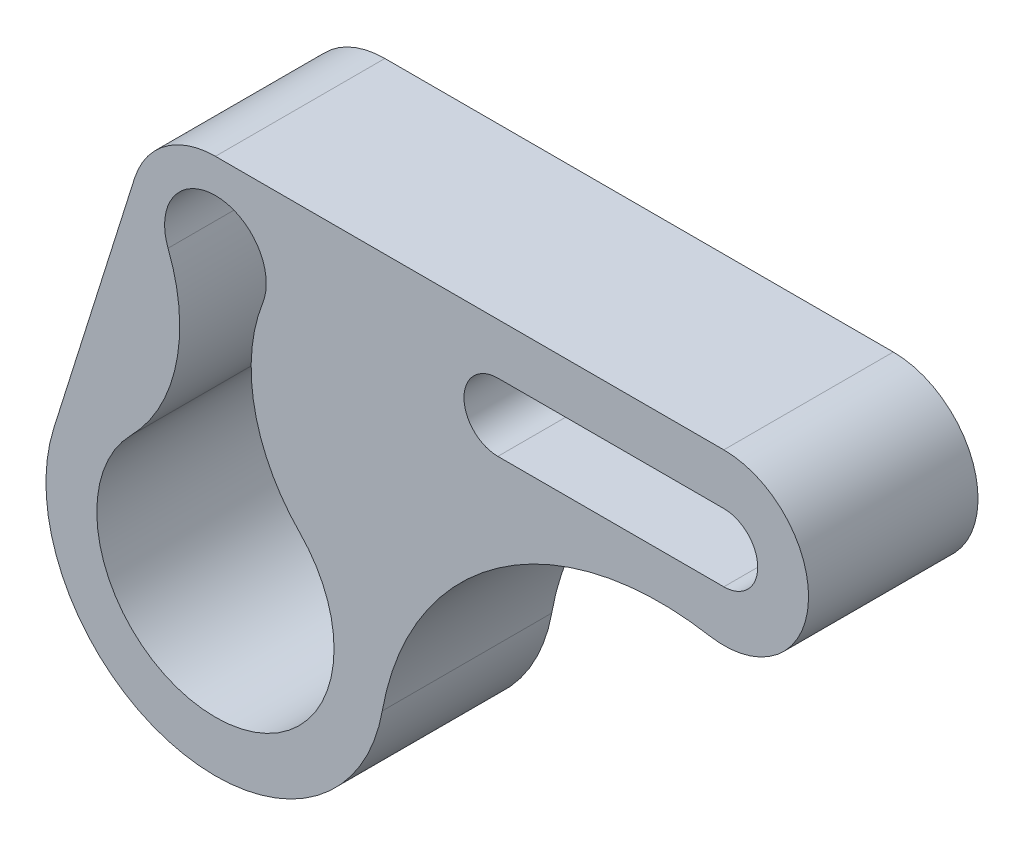
ISO-10303-21;
HEADER;
FILE_DESCRIPTION(('STEP AP214'),'2;1');
FILE_NAME('part.step','',(''),(''),'','','');
FILE_SCHEMA(('AUTOMOTIVE_DESIGN { 1 0 10303 214 1 1 1 1 }'));
ENDSEC;
DATA;
#1=APPLICATION_CONTEXT('core data for automotive mechanical design processes');
#2=APPLICATION_PROTOCOL_DEFINITION('international standard','automotive_design',2000,#1);
#3=PRODUCT_CONTEXT('',#1,'mechanical');
#4=PRODUCT('Part','Part','',(#3));
#5=PRODUCT_RELATED_PRODUCT_CATEGORY('part','',(#4));
#6=PRODUCT_DEFINITION_FORMATION('','',#4);
#7=PRODUCT_DEFINITION_CONTEXT('part definition',#1,'design');
#8=PRODUCT_DEFINITION('design','',#6,#7);
#9=PRODUCT_DEFINITION_SHAPE('','',#8);
#10=(LENGTH_UNIT() NAMED_UNIT(*) SI_UNIT(.MILLI.,.METRE.));
#11=(NAMED_UNIT(*) PLANE_ANGLE_UNIT() SI_UNIT($,.RADIAN.));
#12=(NAMED_UNIT(*) SI_UNIT($,.STERADIAN.) SOLID_ANGLE_UNIT());
#13=UNCERTAINTY_MEASURE_WITH_UNIT(LENGTH_MEASURE(1.E-05),#10,'distance_accuracy_value','');
#14=(GEOMETRIC_REPRESENTATION_CONTEXT(3) GLOBAL_UNCERTAINTY_ASSIGNED_CONTEXT((#13)) GLOBAL_UNIT_ASSIGNED_CONTEXT((#10,
#11,#12)) REPRESENTATION_CONTEXT('',''));
#15=CARTESIAN_POINT('',(0.,0.,0.));
#16=DIRECTION('',(0.,0.,1.));
#17=DIRECTION('',(1.,0.,0.));
#18=AXIS2_PLACEMENT_3D('',#15,#16,#17);
#19=CARTESIAN_POINT('',(0.,50.,15.));
#20=DIRECTION('',(0.,0.,1.));
#21=DIRECTION('',(1.,0.,0.));
#22=AXIS2_PLACEMENT_3D('',#19,#20,#21);
#23=PLANE('',#22);
#24=CARTESIAN_POINT('',(0.,50.,15.));
#25=DIRECTION('',(0.,0.,1.));
#26=DIRECTION('',(1.,0.,0.));
#27=AXIS2_PLACEMENT_3D('',#24,#25,#26);
#28=CIRCLE('',#27,14.9999999999994);
#29=CARTESIAN_POINT('',(0.,64.9999999999989,15.));
#30=VERTEX_POINT('',#29);
#31=CARTESIAN_POINT('',(-14.3090880212542,54.5,15.));
#32=VERTEX_POINT('',#31);
#33=EDGE_CURVE('E201',#30,#32,#28,.T.);
#34=ORIENTED_EDGE('',*,*,#33,.T.);
#35=DIRECTION('',(-0.3,-0.953939201416946,0.));
#36=VECTOR('',#35,1.);
#37=CARTESIAN_POINT('',(-14.3090880212542,54.5,15.));
#38=LINE('',#37,#36);
#39=CARTESIAN_POINT('',(-28.6181760425084,9.,15.));
#40=VERTEX_POINT('',#39);
#41=EDGE_CURVE('E204',#32,#40,#38,.T.);
#42=ORIENTED_EDGE('',*,*,#41,.T.);
#43=CARTESIAN_POINT('',(0.,0.,15.));
#44=DIRECTION('',(0.,0.,1.));
#45=DIRECTION('',(1.,0.,0.));
#46=AXIS2_PLACEMENT_3D('',#43,#44,#45);
#47=CIRCLE('',#46,30.);
#48=CARTESIAN_POINT('',(29.5356455942332,-5.25791206961977,15.));
#49=VERTEX_POINT('',#48);
#50=EDGE_CURVE('E207',#40,#49,#47,.T.);
#51=ORIENTED_EDGE('',*,*,#50,.T.);
#52=CARTESIAN_POINT('',(78.7617215846219,-14.0210988523194,15.));
#53=DIRECTION('',(0.,0.,-1.));
#54=DIRECTION('',(-1.,0.,0.));
#55=AXIS2_PLACEMENT_3D('',#52,#53,#54);
#56=CIRCLE('',#55,50.);
#57=CARTESIAN_POINT('',(87.4065511349127,35.2259002648494,15.));
#58=VERTEX_POINT('',#57);
#59=EDGE_CURVE('E209',#49,#58,#56,.T.);
#60=ORIENTED_EDGE('',*,*,#59,.T.);
#61=CARTESIAN_POINT('',(90.,50.,15.));
#62=DIRECTION('',(0.,0.,1.));
#63=DIRECTION('',(1.,0.,0.));
#64=AXIS2_PLACEMENT_3D('',#61,#62,#63);
#65=CIRCLE('',#64,15.);
#66=CARTESIAN_POINT('',(90.,65.,15.));
#67=VERTEX_POINT('',#66);
#68=EDGE_CURVE('E211',#58,#67,#65,.T.);
#69=ORIENTED_EDGE('',*,*,#68,.T.);
#70=DIRECTION('',(-1.,0.,0.));
#71=VECTOR('',#70,1.);
#72=CARTESIAN_POINT('',(90.,65.,15.));
#73=LINE('',#72,#71);
#74=EDGE_CURVE('E213',#67,#30,#73,.T.);
#75=ORIENTED_EDGE('',*,*,#74,.T.);
#76=EDGE_LOOP('',(#34,#42,#51,#60,#69,#75));
#77=FACE_BOUND('',#76,.T.);
#78=CARTESIAN_POINT('',(0.,50.,15.));
#79=DIRECTION('',(0.,0.,1.));
#80=DIRECTION('',(1.,0.,0.));
#81=AXIS2_PLACEMENT_3D('',#78,#79,#80);
#82=CIRCLE('',#81,8.99999999999999);
#83=CARTESIAN_POINT('',(8.38222972412047,46.7230769230769,15.));
#84=VERTEX_POINT('',#83);
#85=CARTESIAN_POINT('',(-8.38222972412049,46.7230769230769,15.));
#86=VERTEX_POINT('',#85);
#87=EDGE_CURVE('E172',#84,#86,#82,.T.);
#88=ORIENTED_EDGE('',*,*,#87,.F.);
#89=CARTESIAN_POINT('',(36.3229954711888,35.8,15.));
#90=DIRECTION('',(0.,0.,-1.));
#91=DIRECTION('',(1.,0.,0.));
#92=AXIS2_PLACEMENT_3D('',#89,#90,#91);
#93=CIRCLE('',#92,30.);
#94=CARTESIAN_POINT('',(14.9565275469601,14.7411764705882,15.));
#95=VERTEX_POINT('',#94);
#96=EDGE_CURVE('E170',#95,#84,#93,.T.);
#97=ORIENTED_EDGE('',*,*,#96,.F.);
#98=CARTESIAN_POINT('',(0.,0.,15.));
#99=DIRECTION('',(0.,0.,1.));
#100=DIRECTION('',(1.,0.,0.));
#101=AXIS2_PLACEMENT_3D('',#98,#99,#100);
#102=CIRCLE('',#101,21.);
#103=CARTESIAN_POINT('',(-14.9565275469601,14.7411764705882,15.));
#104=VERTEX_POINT('',#103);
#105=EDGE_CURVE('E178',#104,#95,#102,.T.);
#106=ORIENTED_EDGE('',*,*,#105,.F.);
#107=CARTESIAN_POINT('',(-36.3229954711888,35.8,15.));
#108=DIRECTION('',(0.,0.,-1.));
#109=DIRECTION('',(-1.,0.,0.));
#110=AXIS2_PLACEMENT_3D('',#107,#108,#109);
#111=CIRCLE('',#110,30.);
#112=EDGE_CURVE('E175',#86,#104,#111,.T.);
#113=ORIENTED_EDGE('',*,*,#112,.F.);
#114=EDGE_LOOP('',(#88,#97,#106,#113));
#115=FACE_BOUND('',#114,.T.);
#116=DIRECTION('',(1.,0.,0.));
#117=VECTOR('',#116,1.);
#118=CARTESIAN_POINT('',(50.,44.,15.));
#119=LINE('',#118,#117);
#120=CARTESIAN_POINT('',(50.,44.,15.));
#121=VERTEX_POINT('',#120);
#122=CARTESIAN_POINT('',(90.,44.,15.));
#123=VERTEX_POINT('',#122);
#124=EDGE_CURVE('E142',#121,#123,#119,.T.);
#125=ORIENTED_EDGE('',*,*,#124,.F.);
#126=CARTESIAN_POINT('',(50.,50.,15.));
#127=DIRECTION('',(0.,0.,1.));
#128=DIRECTION('',(1.,0.,0.));
#129=AXIS2_PLACEMENT_3D('',#126,#127,#128);
#130=CIRCLE('',#129,6.);
#131=CARTESIAN_POINT('',(50.,56.,15.));
#132=VERTEX_POINT('',#131);
#133=EDGE_CURVE('E134',#132,#121,#130,.T.);
#134=ORIENTED_EDGE('',*,*,#133,.F.);
#135=DIRECTION('',(-1.,0.,0.));
#136=VECTOR('',#135,1.);
#137=CARTESIAN_POINT('',(50.,56.,15.));
#138=LINE('',#137,#136);
#139=CARTESIAN_POINT('',(90.,56.,15.));
#140=VERTEX_POINT('',#139);
#141=EDGE_CURVE('E156',#140,#132,#138,.T.);
#142=ORIENTED_EDGE('',*,*,#141,.F.);
#143=CARTESIAN_POINT('',(90.,50.,15.));
#144=DIRECTION('',(0.,0.,1.));
#145=DIRECTION('',(1.,0.,0.));
#146=AXIS2_PLACEMENT_3D('',#143,#144,#145);
#147=CIRCLE('',#146,6.);
#148=EDGE_CURVE('E154',#123,#140,#147,.T.);
#149=ORIENTED_EDGE('',*,*,#148,.F.);
#150=EDGE_LOOP('',(#125,#134,#142,#149));
#151=FACE_BOUND('',#150,.T.);
#152=ADVANCED_FACE('F33',(#77,#115,#151),#23,.T.);
#153=CARTESIAN_POINT('',(0.,50.,-15.));
#154=DIRECTION('',(0.,0.,1.));
#155=DIRECTION('',(1.,0.,0.));
#156=AXIS2_PLACEMENT_3D('',#153,#154,#155);
#157=PLANE('',#156);
#158=CARTESIAN_POINT('',(36.3229954711888,35.8,-15.));
#159=DIRECTION('',(0.,0.,-1.));
#160=DIRECTION('',(1.,0.,0.));
#161=AXIS2_PLACEMENT_3D('',#158,#159,#160);
#162=CIRCLE('',#161,30.);
#163=CARTESIAN_POINT('',(14.9565275469601,14.7411764705882,-15.));
#164=VERTEX_POINT('',#163);
#165=CARTESIAN_POINT('',(8.38222972412047,46.7230769230769,-15.));
#166=VERTEX_POINT('',#165);
#167=EDGE_CURVE('E150',#164,#166,#162,.T.);
#168=ORIENTED_EDGE('',*,*,#167,.T.);
#169=CARTESIAN_POINT('',(0.,50.,-15.));
#170=DIRECTION('',(0.,0.,1.));
#171=DIRECTION('',(1.,0.,0.));
#172=AXIS2_PLACEMENT_3D('',#169,#170,#171);
#173=CIRCLE('',#172,8.99999999999999);
#174=CARTESIAN_POINT('',(-8.38222972412049,46.7230769230769,-15.));
#175=VERTEX_POINT('',#174);
#176=EDGE_CURVE('E183',#166,#175,#173,.T.);
#177=ORIENTED_EDGE('',*,*,#176,.T.);
#178=CARTESIAN_POINT('',(-36.3229954711888,35.8,-15.));
#179=DIRECTION('',(0.,0.,-1.));
#180=DIRECTION('',(-1.,0.,0.));
#181=AXIS2_PLACEMENT_3D('',#178,#179,#180);
#182=CIRCLE('',#181,30.);
#183=CARTESIAN_POINT('',(-14.9565275469601,14.7411764705882,-15.));
#184=VERTEX_POINT('',#183);
#185=EDGE_CURVE('E186',#175,#184,#182,.T.);
#186=ORIENTED_EDGE('',*,*,#185,.T.);
#187=CARTESIAN_POINT('',(0.,0.,-15.));
#188=DIRECTION('',(0.,0.,1.));
#189=DIRECTION('',(1.,0.,0.));
#190=AXIS2_PLACEMENT_3D('',#187,#188,#189);
#191=CIRCLE('',#190,21.);
#192=EDGE_CURVE('E173',#184,#164,#191,.T.);
#193=ORIENTED_EDGE('',*,*,#192,.T.);
#194=EDGE_LOOP('',(#168,#177,#186,#193));
#195=FACE_BOUND('',#194,.T.);
#196=CARTESIAN_POINT('',(0.,50.,-15.));
#197=DIRECTION('',(0.,0.,1.));
#198=DIRECTION('',(1.,0.,0.));
#199=AXIS2_PLACEMENT_3D('',#196,#197,#198);
#200=CIRCLE('',#199,14.9999999999994);
#201=CARTESIAN_POINT('',(0.,64.9999999999989,-15.));
#202=VERTEX_POINT('',#201);
#203=CARTESIAN_POINT('',(-14.3090880212542,54.5,-15.));
#204=VERTEX_POINT('',#203);
#205=EDGE_CURVE('E200',#202,#204,#200,.T.);
#206=ORIENTED_EDGE('',*,*,#205,.F.);
#207=DIRECTION('',(-1.,0.,0.));
#208=VECTOR('',#207,1.);
#209=CARTESIAN_POINT('',(90.,65.,-15.));
#210=LINE('',#209,#208);
#211=CARTESIAN_POINT('',(90.,65.,-15.));
#212=VERTEX_POINT('',#211);
#213=EDGE_CURVE('E205',#212,#202,#210,.T.);
#214=ORIENTED_EDGE('',*,*,#213,.F.);
#215=CARTESIAN_POINT('',(90.,50.,-15.));
#216=DIRECTION('',(0.,0.,1.));
#217=DIRECTION('',(1.,0.,0.));
#218=AXIS2_PLACEMENT_3D('',#215,#216,#217);
#219=CIRCLE('',#218,15.);
#220=CARTESIAN_POINT('',(87.4065511349127,35.2259002648494,-15.));
#221=VERTEX_POINT('',#220);
#222=EDGE_CURVE('E224',#221,#212,#219,.T.);
#223=ORIENTED_EDGE('',*,*,#222,.F.);
#224=CARTESIAN_POINT('',(78.7617215846219,-14.0210988523194,-15.));
#225=DIRECTION('',(0.,0.,-1.));
#226=DIRECTION('',(-1.,0.,0.));
#227=AXIS2_PLACEMENT_3D('',#224,#225,#226);
#228=CIRCLE('',#227,50.);
#229=CARTESIAN_POINT('',(29.5356455942332,-5.25791206961977,-15.));
#230=VERTEX_POINT('',#229);
#231=EDGE_CURVE('E222',#230,#221,#228,.T.);
#232=ORIENTED_EDGE('',*,*,#231,.F.);
#233=CARTESIAN_POINT('',(0.,0.,-15.));
#234=DIRECTION('',(0.,0.,1.));
#235=DIRECTION('',(1.,0.,0.));
#236=AXIS2_PLACEMENT_3D('',#233,#234,#235);
#237=CIRCLE('',#236,30.);
#238=CARTESIAN_POINT('',(-28.6181760425084,9.,-15.));
#239=VERTEX_POINT('',#238);
#240=EDGE_CURVE('E220',#239,#230,#237,.T.);
#241=ORIENTED_EDGE('',*,*,#240,.F.);
#242=DIRECTION('',(-0.3,-0.953939201416946,0.));
#243=VECTOR('',#242,1.);
#244=CARTESIAN_POINT('',(-14.3090880212542,54.5,-15.));
#245=LINE('',#244,#243);
#246=EDGE_CURVE('E218',#204,#239,#245,.T.);
#247=ORIENTED_EDGE('',*,*,#246,.F.);
#248=EDGE_LOOP('',(#206,#214,#223,#232,#241,#247));
#249=FACE_BOUND('',#248,.T.);
#250=CARTESIAN_POINT('',(50.,50.,-15.));
#251=DIRECTION('',(0.,0.,1.));
#252=DIRECTION('',(1.,0.,0.));
#253=AXIS2_PLACEMENT_3D('',#250,#251,#252);
#254=CIRCLE('',#253,6.);
#255=CARTESIAN_POINT('',(50.,56.,-15.));
#256=VERTEX_POINT('',#255);
#257=CARTESIAN_POINT('',(50.,44.,-15.));
#258=VERTEX_POINT('',#257);
#259=EDGE_CURVE('E56',#256,#258,#254,.T.);
#260=ORIENTED_EDGE('',*,*,#259,.T.);
#261=DIRECTION('',(1.,0.,0.));
#262=VECTOR('',#261,1.);
#263=CARTESIAN_POINT('',(50.,44.,-15.));
#264=LINE('',#263,#262);
#265=CARTESIAN_POINT('',(90.,44.,-15.));
#266=VERTEX_POINT('',#265);
#267=EDGE_CURVE('E149',#258,#266,#264,.T.);
#268=ORIENTED_EDGE('',*,*,#267,.T.);
#269=CARTESIAN_POINT('',(90.,50.,-15.));
#270=DIRECTION('',(0.,0.,1.));
#271=DIRECTION('',(1.,0.,0.));
#272=AXIS2_PLACEMENT_3D('',#269,#270,#271);
#273=CIRCLE('',#272,6.);
#274=CARTESIAN_POINT('',(90.,56.,-15.));
#275=VERTEX_POINT('',#274);
#276=EDGE_CURVE('E162',#266,#275,#273,.T.);
#277=ORIENTED_EDGE('',*,*,#276,.T.);
#278=DIRECTION('',(-1.,0.,0.));
#279=VECTOR('',#278,1.);
#280=CARTESIAN_POINT('',(50.,56.,-15.));
#281=LINE('',#280,#279);
#282=EDGE_CURVE('E143',#275,#256,#281,.T.);
#283=ORIENTED_EDGE('',*,*,#282,.T.);
#284=EDGE_LOOP('',(#260,#268,#277,#283));
#285=FACE_BOUND('',#284,.T.);
#286=ADVANCED_FACE('F248',(#195,#249,#285),#157,.F.);
#287=CARTESIAN_POINT('',(0.,50.,15.));
#288=DIRECTION('',(0.,0.,-1.));
#289=DIRECTION('',(-1.,0.,0.));
#290=AXIS2_PLACEMENT_3D('',#287,#288,#289);
#291=CYLINDRICAL_SURFACE('',#290,14.9999999999994);
#292=ORIENTED_EDGE('',*,*,#205,.T.);
#293=DIRECTION('',(0.,0.,-1.));
#294=VECTOR('',#293,1.);
#295=CARTESIAN_POINT('',(-14.3090880212542,54.5,15.));
#296=LINE('',#295,#294);
#297=EDGE_CURVE('E11',#32,#204,#296,.T.);
#298=ORIENTED_EDGE('',*,*,#297,.F.);
#299=ORIENTED_EDGE('',*,*,#33,.F.);
#300=DIRECTION('',(0.,0.,-1.));
#301=VECTOR('',#300,1.);
#302=CARTESIAN_POINT('',(0.,64.9999999999989,15.));
#303=LINE('',#302,#301);
#304=EDGE_CURVE('E215',#30,#202,#303,.T.);
#305=ORIENTED_EDGE('',*,*,#304,.T.);
#306=EDGE_LOOP('',(#292,#298,#299,#305));
#307=FACE_BOUND('',#306,.T.);
#308=ADVANCED_FACE('F35',(#307),#291,.T.);
#309=CARTESIAN_POINT('',(-14.3090880212542,54.5,15.));
#310=DIRECTION('',(0.953939201416946,-0.3,0.));
#311=DIRECTION('',(0.3,0.953939201416946,0.));
#312=AXIS2_PLACEMENT_3D('',#309,#310,#311);
#313=PLANE('',#312);
#314=ORIENTED_EDGE('',*,*,#246,.T.);
#315=DIRECTION('',(0.,0.,-1.));
#316=VECTOR('',#315,1.);
#317=CARTESIAN_POINT('',(-28.6181760425084,9.,15.));
#318=LINE('',#317,#316);
#319=EDGE_CURVE('E41',#40,#239,#318,.T.);
#320=ORIENTED_EDGE('',*,*,#319,.F.);
#321=ORIENTED_EDGE('',*,*,#41,.F.);
#322=ORIENTED_EDGE('',*,*,#297,.T.);
#323=EDGE_LOOP('',(#314,#320,#321,#322));
#324=FACE_BOUND('',#323,.T.);
#325=ADVANCED_FACE('F266',(#324),#313,.F.);
#326=CARTESIAN_POINT('',(0.,0.,15.));
#327=DIRECTION('',(0.,0.,-1.));
#328=DIRECTION('',(-1.,0.,0.));
#329=AXIS2_PLACEMENT_3D('',#326,#327,#328);
#330=CYLINDRICAL_SURFACE('',#329,30.);
#331=ORIENTED_EDGE('',*,*,#240,.T.);
#332=DIRECTION('',(0.,0.,-1.));
#333=VECTOR('',#332,1.);
#334=CARTESIAN_POINT('',(29.5356455942332,-5.25791206961977,15.));
#335=LINE('',#334,#333);
#336=EDGE_CURVE('E235',#49,#230,#335,.T.);
#337=ORIENTED_EDGE('',*,*,#336,.F.);
#338=ORIENTED_EDGE('',*,*,#50,.F.);
#339=ORIENTED_EDGE('',*,*,#319,.T.);
#340=EDGE_LOOP('',(#331,#337,#338,#339));
#341=FACE_BOUND('',#340,.T.);
#342=ADVANCED_FACE('F242',(#341),#330,.T.);
#343=CARTESIAN_POINT('',(78.7617215846219,-14.0210988523194,15.));
#344=DIRECTION('',(0.,0.,-1.));
#345=DIRECTION('',(-1.,0.,0.));
#346=AXIS2_PLACEMENT_3D('',#343,#344,#345);
#347=CYLINDRICAL_SURFACE('',#346,50.);
#348=ORIENTED_EDGE('',*,*,#231,.T.);
#349=DIRECTION('',(0.,0.,-1.));
#350=VECTOR('',#349,1.);
#351=CARTESIAN_POINT('',(87.4065511349127,35.2259002648494,15.));
#352=LINE('',#351,#350);
#353=EDGE_CURVE('E232',#58,#221,#352,.T.);
#354=ORIENTED_EDGE('',*,*,#353,.F.);
#355=ORIENTED_EDGE('',*,*,#59,.F.);
#356=ORIENTED_EDGE('',*,*,#336,.T.);
#357=EDGE_LOOP('',(#348,#354,#355,#356));
#358=FACE_BOUND('',#357,.T.);
#359=ADVANCED_FACE('F254',(#358),#347,.F.);
#360=CARTESIAN_POINT('',(90.,50.,15.));
#361=DIRECTION('',(0.,0.,-1.));
#362=DIRECTION('',(-1.,0.,0.));
#363=AXIS2_PLACEMENT_3D('',#360,#361,#362);
#364=CYLINDRICAL_SURFACE('',#363,15.);
#365=ORIENTED_EDGE('',*,*,#222,.T.);
#366=DIRECTION('',(0.,0.,-1.));
#367=VECTOR('',#366,1.);
#368=CARTESIAN_POINT('',(90.,65.,15.));
#369=LINE('',#368,#367);
#370=EDGE_CURVE('E229',#67,#212,#369,.T.);
#371=ORIENTED_EDGE('',*,*,#370,.F.);
#372=ORIENTED_EDGE('',*,*,#68,.F.);
#373=ORIENTED_EDGE('',*,*,#353,.T.);
#374=EDGE_LOOP('',(#365,#371,#372,#373));
#375=FACE_BOUND('',#374,.T.);
#376=ADVANCED_FACE('F258',(#375),#364,.T.);
#377=CARTESIAN_POINT('',(90.,65.,15.));
#378=DIRECTION('',(0.,-1.,0.));
#379=DIRECTION('',(1.,0.,0.));
#380=AXIS2_PLACEMENT_3D('',#377,#378,#379);
#381=PLANE('',#380);
#382=ORIENTED_EDGE('',*,*,#213,.T.);
#383=ORIENTED_EDGE('',*,*,#304,.F.);
#384=ORIENTED_EDGE('',*,*,#74,.F.);
#385=ORIENTED_EDGE('',*,*,#370,.T.);
#386=EDGE_LOOP('',(#382,#383,#384,#385));
#387=FACE_BOUND('',#386,.T.);
#388=ADVANCED_FACE('F269',(#387),#381,.F.);
#389=CARTESIAN_POINT('',(36.3229954711888,35.8,15.));
#390=DIRECTION('',(0.,0.,-1.));
#391=DIRECTION('',(-1.,0.,0.));
#392=AXIS2_PLACEMENT_3D('',#389,#390,#391);
#393=CYLINDRICAL_SURFACE('',#392,30.);
#394=ORIENTED_EDGE('',*,*,#167,.F.);
#395=DIRECTION('',(0.,0.,-1.));
#396=VECTOR('',#395,1.);
#397=CARTESIAN_POINT('',(14.9565275469601,14.7411764705882,15.));
#398=LINE('',#397,#396);
#399=EDGE_CURVE('E180',#95,#164,#398,.T.);
#400=ORIENTED_EDGE('',*,*,#399,.F.);
#401=ORIENTED_EDGE('',*,*,#96,.T.);
#402=DIRECTION('',(0.,0.,-1.));
#403=VECTOR('',#402,1.);
#404=CARTESIAN_POINT('',(8.38222972412047,46.7230769230769,15.));
#405=LINE('',#404,#403);
#406=EDGE_CURVE('E197',#84,#166,#405,.T.);
#407=ORIENTED_EDGE('',*,*,#406,.T.);
#408=EDGE_LOOP('',(#394,#400,#401,#407));
#409=FACE_BOUND('',#408,.T.);
#410=ADVANCED_FACE('F271',(#409),#393,.T.);
#411=CARTESIAN_POINT('',(0.,50.,15.));
#412=DIRECTION('',(0.,0.,-1.));
#413=DIRECTION('',(-1.,0.,0.));
#414=AXIS2_PLACEMENT_3D('',#411,#412,#413);
#415=CYLINDRICAL_SURFACE('',#414,8.99999999999999);
#416=ORIENTED_EDGE('',*,*,#176,.F.);
#417=ORIENTED_EDGE('',*,*,#406,.F.);
#418=ORIENTED_EDGE('',*,*,#87,.T.);
#419=DIRECTION('',(0.,0.,-1.));
#420=VECTOR('',#419,1.);
#421=CARTESIAN_POINT('',(-8.38222972412049,46.7230769230769,15.));
#422=LINE('',#421,#420);
#423=EDGE_CURVE('E195',#86,#175,#422,.T.);
#424=ORIENTED_EDGE('',*,*,#423,.T.);
#425=EDGE_LOOP('',(#416,#417,#418,#424));
#426=FACE_BOUND('',#425,.T.);
#427=ADVANCED_FACE('F277',(#426),#415,.F.);
#428=CARTESIAN_POINT('',(-36.3229954711888,35.8,15.));
#429=DIRECTION('',(0.,0.,-1.));
#430=DIRECTION('',(-1.,0.,0.));
#431=AXIS2_PLACEMENT_3D('',#428,#429,#430);
#432=CYLINDRICAL_SURFACE('',#431,30.);
#433=ORIENTED_EDGE('',*,*,#185,.F.);
#434=ORIENTED_EDGE('',*,*,#423,.F.);
#435=ORIENTED_EDGE('',*,*,#112,.T.);
#436=DIRECTION('',(0.,0.,-1.));
#437=VECTOR('',#436,1.);
#438=CARTESIAN_POINT('',(-14.9565275469601,14.7411764705882,15.));
#439=LINE('',#438,#437);
#440=EDGE_CURVE('E193',#104,#184,#439,.T.);
#441=ORIENTED_EDGE('',*,*,#440,.T.);
#442=EDGE_LOOP('',(#433,#434,#435,#441));
#443=FACE_BOUND('',#442,.T.);
#444=ADVANCED_FACE('F291',(#443),#432,.T.);
#445=CARTESIAN_POINT('',(0.,0.,15.));
#446=DIRECTION('',(0.,0.,-1.));
#447=DIRECTION('',(-1.,0.,0.));
#448=AXIS2_PLACEMENT_3D('',#445,#446,#447);
#449=CYLINDRICAL_SURFACE('',#448,21.);
#450=ORIENTED_EDGE('',*,*,#192,.F.);
#451=ORIENTED_EDGE('',*,*,#440,.F.);
#452=ORIENTED_EDGE('',*,*,#105,.T.);
#453=ORIENTED_EDGE('',*,*,#399,.T.);
#454=EDGE_LOOP('',(#450,#451,#452,#453));
#455=FACE_BOUND('',#454,.T.);
#456=ADVANCED_FACE('F295',(#455),#449,.F.);
#457=CARTESIAN_POINT('',(50.,50.,15.));
#458=DIRECTION('',(0.,0.,-1.));
#459=DIRECTION('',(-1.,0.,0.));
#460=AXIS2_PLACEMENT_3D('',#457,#458,#459);
#461=CYLINDRICAL_SURFACE('',#460,6.);
#462=ORIENTED_EDGE('',*,*,#259,.F.);
#463=DIRECTION('',(0.,0.,-1.));
#464=VECTOR('',#463,1.);
#465=CARTESIAN_POINT('',(50.,56.,15.));
#466=LINE('',#465,#464);
#467=EDGE_CURVE('E138',#132,#256,#466,.T.);
#468=ORIENTED_EDGE('',*,*,#467,.F.);
#469=ORIENTED_EDGE('',*,*,#133,.T.);
#470=DIRECTION('',(0.,0.,-1.));
#471=VECTOR('',#470,1.);
#472=CARTESIAN_POINT('',(50.,44.,15.));
#473=LINE('',#472,#471);
#474=EDGE_CURVE('E137',#121,#258,#473,.T.);
#475=ORIENTED_EDGE('',*,*,#474,.T.);
#476=EDGE_LOOP('',(#462,#468,#469,#475));
#477=FACE_BOUND('',#476,.T.);
#478=ADVANCED_FACE('F136',(#477),#461,.F.);
#479=CARTESIAN_POINT('',(50.,44.,15.));
#480=DIRECTION('',(0.,1.,0.));
#481=DIRECTION('',(0.,0.,1.));
#482=AXIS2_PLACEMENT_3D('',#479,#480,#481);
#483=PLANE('',#482);
#484=ORIENTED_EDGE('',*,*,#267,.F.);
#485=ORIENTED_EDGE('',*,*,#474,.F.);
#486=ORIENTED_EDGE('',*,*,#124,.T.);
#487=DIRECTION('',(0.,0.,-1.));
#488=VECTOR('',#487,1.);
#489=CARTESIAN_POINT('',(90.,44.,15.));
#490=LINE('',#489,#488);
#491=EDGE_CURVE('E151',#123,#266,#490,.T.);
#492=ORIENTED_EDGE('',*,*,#491,.T.);
#493=EDGE_LOOP('',(#484,#485,#486,#492));
#494=FACE_BOUND('',#493,.T.);
#495=ADVANCED_FACE('F146',(#494),#483,.T.);
#496=CARTESIAN_POINT('',(90.,50.,15.));
#497=DIRECTION('',(0.,0.,-1.));
#498=DIRECTION('',(-1.,0.,0.));
#499=AXIS2_PLACEMENT_3D('',#496,#497,#498);
#500=CYLINDRICAL_SURFACE('',#499,6.);
#501=ORIENTED_EDGE('',*,*,#276,.F.);
#502=ORIENTED_EDGE('',*,*,#491,.F.);
#503=ORIENTED_EDGE('',*,*,#148,.T.);
#504=DIRECTION('',(0.,0.,-1.));
#505=VECTOR('',#504,1.);
#506=CARTESIAN_POINT('',(90.,56.,15.));
#507=LINE('',#506,#505);
#508=EDGE_CURVE('E48',#140,#275,#507,.T.);
#509=ORIENTED_EDGE('',*,*,#508,.T.);
#510=EDGE_LOOP('',(#501,#502,#503,#509));
#511=FACE_BOUND('',#510,.T.);
#512=ADVANCED_FACE('F304',(#511),#500,.F.);
#513=CARTESIAN_POINT('',(50.,56.,15.));
#514=DIRECTION('',(0.,-1.,0.));
#515=DIRECTION('',(0.,0.,-1.));
#516=AXIS2_PLACEMENT_3D('',#513,#514,#515);
#517=PLANE('',#516);
#518=ORIENTED_EDGE('',*,*,#282,.F.);
#519=ORIENTED_EDGE('',*,*,#508,.F.);
#520=ORIENTED_EDGE('',*,*,#141,.T.);
#521=ORIENTED_EDGE('',*,*,#467,.T.);
#522=EDGE_LOOP('',(#518,#519,#520,#521));
#523=FACE_BOUND('',#522,.T.);
#524=ADVANCED_FACE('F307',(#523),#517,.T.);
#525=CLOSED_SHELL('',(#152,#286,#308,#325,#342,#359,#376,#388,#410,#427,#444,#456,#478,#495,
#512,#524));
#526=MANIFOLD_SOLID_BREP('B2',#525);
#527=ADVANCED_BREP_SHAPE_REPRESENTATION('',(#18,#526),#14);
#528=SHAPE_DEFINITION_REPRESENTATION(#9,#527);
ENDSEC;
END-ISO-10303-21;
